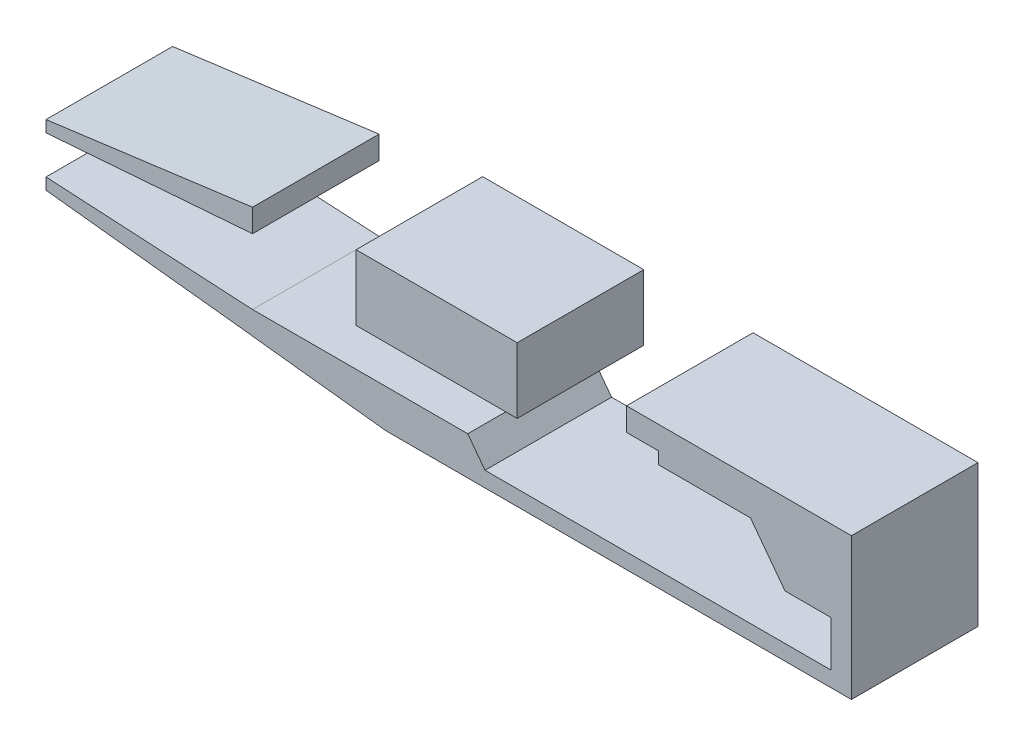
ISO-10303-21;
HEADER;
FILE_DESCRIPTION(('STEP AP214'),'2;1');
FILE_NAME('part.step','',(''),(''),'','','');
FILE_SCHEMA(('AUTOMOTIVE_DESIGN { 1 0 10303 214 1 1 1 1 }'));
ENDSEC;
DATA;
#1=APPLICATION_CONTEXT('core data for automotive mechanical design processes');
#2=APPLICATION_PROTOCOL_DEFINITION('international standard','automotive_design',2000,#1);
#3=PRODUCT_CONTEXT('',#1,'mechanical');
#4=PRODUCT('Part','Part','',(#3));
#5=PRODUCT_RELATED_PRODUCT_CATEGORY('part','',(#4));
#6=PRODUCT_DEFINITION_FORMATION('','',#4);
#7=PRODUCT_DEFINITION_CONTEXT('part definition',#1,'design');
#8=PRODUCT_DEFINITION('design','',#6,#7);
#9=PRODUCT_DEFINITION_SHAPE('','',#8);
#10=(LENGTH_UNIT() NAMED_UNIT(*) SI_UNIT(.MILLI.,.METRE.));
#11=(NAMED_UNIT(*) PLANE_ANGLE_UNIT() SI_UNIT($,.RADIAN.));
#12=(NAMED_UNIT(*) SI_UNIT($,.STERADIAN.) SOLID_ANGLE_UNIT());
#13=UNCERTAINTY_MEASURE_WITH_UNIT(LENGTH_MEASURE(1.E-05),#10,'distance_accuracy_value','');
#14=(GEOMETRIC_REPRESENTATION_CONTEXT(3) GLOBAL_UNCERTAINTY_ASSIGNED_CONTEXT((#13)) GLOBAL_UNIT_ASSIGNED_CONTEXT((#10,
#11,#12)) REPRESENTATION_CONTEXT('',''));
#15=CARTESIAN_POINT('',(0.,0.,0.));
#16=DIRECTION('',(0.,0.,1.));
#17=DIRECTION('',(1.,0.,0.));
#18=AXIS2_PLACEMENT_3D('',#15,#16,#17);
#19=CARTESIAN_POINT('',(-350.,110.,-55.));
#20=DIRECTION('',(0.,0.,1.));
#21=DIRECTION('',(1.,0.,0.));
#22=AXIS2_PLACEMENT_3D('',#19,#20,#21);
#23=PLANE('',#22);
#24=DIRECTION('',(0.6,-0.8,0.));
#25=VECTOR('',#24,1.);
#26=CARTESIAN_POINT('',(-158.611661767627,253.54125367428,-55.));
#27=LINE('',#26,#25);
#28=CARTESIAN_POINT('',(16.5442784880835,20.,-55.));
#29=VERTEX_POINT('',#28);
#30=CARTESIAN_POINT('',(31.5442784880835,0.,-55.));
#31=VERTEX_POINT('',#30);
#32=EDGE_CURVE('E353',#29,#31,#27,.T.);
#33=ORIENTED_EDGE('',*,*,#32,.T.);
#34=DIRECTION('',(-1.,0.,0.));
#35=VECTOR('',#34,1.);
#36=CARTESIAN_POINT('',(-171.496430607468,0.,-55.));
#37=LINE('',#36,#35);
#38=CARTESIAN_POINT('',(332.25,0.,-55.));
#39=VERTEX_POINT('',#38);
#40=EDGE_CURVE('E308',#39,#31,#37,.T.);
#41=ORIENTED_EDGE('',*,*,#40,.F.);
#42=DIRECTION('',(0.,-1.,0.));
#43=VECTOR('',#42,1.);
#44=CARTESIAN_POINT('',(332.25,110.,-55.));
#45=LINE('',#44,#43);
#46=CARTESIAN_POINT('',(332.25,39.5416923837129,-55.));
#47=VERTEX_POINT('',#46);
#48=EDGE_CURVE('E263',#47,#39,#45,.T.);
#49=ORIENTED_EDGE('',*,*,#48,.F.);
#50=DIRECTION('',(1.,0.,0.));
#51=VECTOR('',#50,1.);
#52=CARTESIAN_POINT('',(-350.,39.5416923837129,-55.));
#53=LINE('',#52,#51);
#54=CARTESIAN_POINT('',(292.25,39.5416923837129,-55.));
#55=VERTEX_POINT('',#54);
#56=EDGE_CURVE('E589',#55,#47,#53,.T.);
#57=ORIENTED_EDGE('',*,*,#56,.F.);
#58=DIRECTION('',(0.6,-0.8,0.));
#59=VECTOR('',#58,1.);
#60=CARTESIAN_POINT('',(27.2200123441825,392.915009258137,-55.));
#61=LINE('',#60,#59);
#62=CARTESIAN_POINT('',(262.25,79.5416923837129,-55.));
#63=VERTEX_POINT('',#62);
#64=EDGE_CURVE('E586',#63,#55,#61,.T.);
#65=ORIENTED_EDGE('',*,*,#64,.F.);
#66=DIRECTION('',(1.,0.,0.));
#67=VECTOR('',#66,1.);
#68=CARTESIAN_POINT('',(-350.,79.5416923837129,-55.));
#69=LINE('',#68,#67);
#70=CARTESIAN_POINT('',(182.25,79.5416923837129,-55.));
#71=VERTEX_POINT('',#70);
#72=EDGE_CURVE('E577',#71,#63,#69,.T.);
#73=ORIENTED_EDGE('',*,*,#72,.F.);
#74=DIRECTION('',(0.,-1.,0.));
#75=VECTOR('',#74,1.);
#76=CARTESIAN_POINT('',(182.25,110.,-55.));
#77=LINE('',#76,#75);
#78=CARTESIAN_POINT('',(182.25,90.,-55.));
#79=VERTEX_POINT('',#78);
#80=EDGE_CURVE('E569',#79,#71,#77,.T.);
#81=ORIENTED_EDGE('',*,*,#80,.F.);
#82=DIRECTION('',(1.,0.,0.));
#83=VECTOR('',#82,1.);
#84=CARTESIAN_POINT('',(-350.,90.,-55.));
#85=LINE('',#84,#83);
#86=CARTESIAN_POINT('',(154.5,90.,-55.));
#87=VERTEX_POINT('',#86);
#88=EDGE_CURVE('E562',#87,#79,#85,.T.);
#89=ORIENTED_EDGE('',*,*,#88,.F.);
#90=DIRECTION('',(0.,-1.,0.));
#91=VECTOR('',#90,1.);
#92=CARTESIAN_POINT('',(154.5,110.,-55.));
#93=LINE('',#92,#91);
#94=CARTESIAN_POINT('',(154.5,110.,-55.));
#95=VERTEX_POINT('',#94);
#96=EDGE_CURVE('E268',#95,#87,#93,.T.);
#97=ORIENTED_EDGE('',*,*,#96,.F.);
#98=DIRECTION('',(-1.,0.,0.));
#99=VECTOR('',#98,1.);
#100=CARTESIAN_POINT('',(-350.,110.,-55.));
#101=LINE('',#100,#99);
#102=CARTESIAN_POINT('',(350.,110.,-55.));
#103=VERTEX_POINT('',#102);
#104=EDGE_CURVE('E260',#103,#95,#101,.T.);
#105=ORIENTED_EDGE('',*,*,#104,.F.);
#106=DIRECTION('',(0.,1.,0.));
#107=VECTOR('',#106,1.);
#108=CARTESIAN_POINT('',(350.,0.,-55.));
#109=LINE('',#108,#107);
#110=CARTESIAN_POINT('',(350.,-13.3179448044646,-55.));
#111=VERTEX_POINT('',#110);
#112=EDGE_CURVE('E242',#111,#103,#109,.T.);
#113=ORIENTED_EDGE('',*,*,#112,.F.);
#114=DIRECTION('',(1.,0.,0.));
#115=VECTOR('',#114,1.);
#116=CARTESIAN_POINT('',(-54.7521543501291,-13.3179448044646,-55.));
#117=LINE('',#116,#115);
#118=CARTESIAN_POINT('',(-54.7521543501291,-13.3179448044646,-55.));
#119=VERTEX_POINT('',#118);
#120=EDGE_CURVE('E282',#119,#111,#117,.T.);
#121=ORIENTED_EDGE('',*,*,#120,.F.);
#122=DIRECTION('',(0.993555941863674,-0.113342800333275,0.));
#123=VECTOR('',#122,1.);
#124=CARTESIAN_POINT('',(-171.496430607468,0.,-55.));
#125=LINE('',#124,#123);
#126=CARTESIAN_POINT('',(-171.496430607468,0.,-55.));
#127=VERTEX_POINT('',#126);
#128=EDGE_CURVE('E309',#127,#119,#125,.T.);
#129=ORIENTED_EDGE('',*,*,#128,.F.);
#130=CARTESIAN_POINT('',(-170.5,0.,-55.));
#131=VERTEX_POINT('',#130);
#132=EDGE_CURVE('E252',#131,#127,#37,.T.);
#133=ORIENTED_EDGE('',*,*,#132,.F.);
#134=DIRECTION('',(-0.993849927445116,0.110735367960459,0.));
#135=VECTOR('',#134,1.);
#136=CARTESIAN_POINT('',(-359.90489036718,21.1036089545604,-55.));
#137=LINE('',#136,#135);
#138=CARTESIAN_POINT('',(-350.,20.,-55.));
#139=VERTEX_POINT('',#138);
#140=EDGE_CURVE('E301',#131,#139,#137,.T.);
#141=ORIENTED_EDGE('',*,*,#140,.T.);
#142=DIRECTION('',(0.,-1.,0.));
#143=VECTOR('',#142,1.);
#144=CARTESIAN_POINT('',(-350.,110.,-55.));
#145=LINE('',#144,#143);
#146=CARTESIAN_POINT('',(-350.,30.,-55.));
#147=VERTEX_POINT('',#146);
#148=EDGE_CURVE('E365',#147,#139,#145,.T.);
#149=ORIENTED_EDGE('',*,*,#148,.F.);
#150=DIRECTION('',(0.998451783776705,-0.0556240548065017,0.));
#151=VECTOR('',#150,1.);
#152=CARTESIAN_POINT('',(-354.443034939396,30.2475228378493,-55.));
#153=LINE('',#152,#151);
#154=CARTESIAN_POINT('',(-170.5,20.,-55.));
#155=VERTEX_POINT('',#154);
#156=EDGE_CURVE('E359',#147,#155,#153,.T.);
#157=ORIENTED_EDGE('',*,*,#156,.T.);
#158=DIRECTION('',(1.,0.,0.));
#159=VECTOR('',#158,1.);
#160=CARTESIAN_POINT('',(-350.,20.,-55.));
#161=LINE('',#160,#159);
#162=EDGE_CURVE('E295',#155,#29,#161,.T.);
#163=ORIENTED_EDGE('',*,*,#162,.T.);
#164=EDGE_LOOP('',(#33,#41,#49,#57,#65,#73,#81,#89,#97,#105,#113,#121,#129,#133,#141,#149,#157,#163));
#165=FACE_BOUND('',#164,.T.);
#166=ADVANCED_FACE('F116',(#165),#23,.F.);
#167=CARTESIAN_POINT('',(-350.,110.,55.));
#168=DIRECTION('',(0.,0.,-1.));
#169=DIRECTION('',(-1.,0.,0.));
#170=AXIS2_PLACEMENT_3D('',#167,#168,#169);
#171=PLANE('',#170);
#172=DIRECTION('',(0.,-1.,0.));
#173=VECTOR('',#172,1.);
#174=CARTESIAN_POINT('',(-350.,110.,55.));
#175=LINE('',#174,#173);
#176=CARTESIAN_POINT('',(-350.,30.,55.));
#177=VERTEX_POINT('',#176);
#178=CARTESIAN_POINT('',(-350.,20.,55.));
#179=VERTEX_POINT('',#178);
#180=EDGE_CURVE('E369',#177,#179,#175,.T.);
#181=ORIENTED_EDGE('',*,*,#180,.T.);
#182=DIRECTION('',(-0.993849927445116,0.110735367960459,0.));
#183=VECTOR('',#182,1.);
#184=CARTESIAN_POINT('',(-2.09072585280616,-18.7642645289353,55.));
#185=LINE('',#184,#183);
#186=CARTESIAN_POINT('',(-170.5,0.,55.));
#187=VERTEX_POINT('',#186);
#188=EDGE_CURVE('E302',#187,#179,#185,.T.);
#189=ORIENTED_EDGE('',*,*,#188,.F.);
#190=DIRECTION('',(-1.,0.,0.));
#191=VECTOR('',#190,1.);
#192=CARTESIAN_POINT('',(-171.496430607468,0.,55.));
#193=LINE('',#192,#191);
#194=CARTESIAN_POINT('',(-171.496430607468,0.,55.));
#195=VERTEX_POINT('',#194);
#196=EDGE_CURVE('E281',#187,#195,#193,.T.);
#197=ORIENTED_EDGE('',*,*,#196,.T.);
#198=DIRECTION('',(0.993555941863674,-0.113342800333275,0.));
#199=VECTOR('',#198,1.);
#200=CARTESIAN_POINT('',(-171.496430607468,0.,55.));
#201=LINE('',#200,#199);
#202=CARTESIAN_POINT('',(-54.7521543501291,-13.3179448044646,55.));
#203=VERTEX_POINT('',#202);
#204=EDGE_CURVE('E285',#195,#203,#201,.T.);
#205=ORIENTED_EDGE('',*,*,#204,.T.);
#206=DIRECTION('',(1.,0.,0.));
#207=VECTOR('',#206,1.);
#208=CARTESIAN_POINT('',(-54.7521543501291,-13.3179448044646,55.));
#209=LINE('',#208,#207);
#210=CARTESIAN_POINT('',(350.,-13.3179448044646,55.));
#211=VERTEX_POINT('',#210);
#212=EDGE_CURVE('E317',#203,#211,#209,.T.);
#213=ORIENTED_EDGE('',*,*,#212,.T.);
#214=DIRECTION('',(0.,1.,0.));
#215=VECTOR('',#214,1.);
#216=CARTESIAN_POINT('',(350.,0.,55.));
#217=LINE('',#216,#215);
#218=CARTESIAN_POINT('',(350.,110.,55.));
#219=VERTEX_POINT('',#218);
#220=EDGE_CURVE('E280',#211,#219,#217,.T.);
#221=ORIENTED_EDGE('',*,*,#220,.T.);
#222=DIRECTION('',(1.,0.,0.));
#223=VECTOR('',#222,1.);
#224=CARTESIAN_POINT('',(-350.,110.,55.));
#225=LINE('',#224,#223);
#226=CARTESIAN_POINT('',(154.5,110.,55.));
#227=VERTEX_POINT('',#226);
#228=EDGE_CURVE('E262',#227,#219,#225,.T.);
#229=ORIENTED_EDGE('',*,*,#228,.F.);
#230=DIRECTION('',(0.,-1.,0.));
#231=VECTOR('',#230,1.);
#232=CARTESIAN_POINT('',(154.5,0.,55.));
#233=LINE('',#232,#231);
#234=CARTESIAN_POINT('',(154.5,90.,55.));
#235=VERTEX_POINT('',#234);
#236=EDGE_CURVE('E597',#227,#235,#233,.T.);
#237=ORIENTED_EDGE('',*,*,#236,.T.);
#238=DIRECTION('',(1.,0.,0.));
#239=VECTOR('',#238,1.);
#240=CARTESIAN_POINT('',(0.,90.,55.));
#241=LINE('',#240,#239);
#242=CARTESIAN_POINT('',(182.25,90.,55.));
#243=VERTEX_POINT('',#242);
#244=EDGE_CURVE('E600',#235,#243,#241,.T.);
#245=ORIENTED_EDGE('',*,*,#244,.T.);
#246=DIRECTION('',(0.,-1.,0.));
#247=VECTOR('',#246,1.);
#248=CARTESIAN_POINT('',(182.25,0.,55.));
#249=LINE('',#248,#247);
#250=CARTESIAN_POINT('',(182.25,79.5416923837129,55.));
#251=VERTEX_POINT('',#250);
#252=EDGE_CURVE('E572',#243,#251,#249,.T.);
#253=ORIENTED_EDGE('',*,*,#252,.T.);
#254=DIRECTION('',(1.,0.,0.));
#255=VECTOR('',#254,1.);
#256=CARTESIAN_POINT('',(0.,79.5416923837129,55.));
#257=LINE('',#256,#255);
#258=CARTESIAN_POINT('',(262.25,79.5416923837129,55.));
#259=VERTEX_POINT('',#258);
#260=EDGE_CURVE('E603',#251,#259,#257,.T.);
#261=ORIENTED_EDGE('',*,*,#260,.T.);
#262=DIRECTION('',(0.6,-0.8,0.));
#263=VECTOR('',#262,1.);
#264=CARTESIAN_POINT('',(206.020012344182,154.515009258137,55.));
#265=LINE('',#264,#263);
#266=CARTESIAN_POINT('',(292.25,39.5416923837129,55.));
#267=VERTEX_POINT('',#266);
#268=EDGE_CURVE('E274',#259,#267,#265,.T.);
#269=ORIENTED_EDGE('',*,*,#268,.T.);
#270=DIRECTION('',(1.,0.,0.));
#271=VECTOR('',#270,1.);
#272=CARTESIAN_POINT('',(0.,39.5416923837129,55.));
#273=LINE('',#272,#271);
#274=CARTESIAN_POINT('',(332.25,39.5416923837129,55.));
#275=VERTEX_POINT('',#274);
#276=EDGE_CURVE('E270',#267,#275,#273,.T.);
#277=ORIENTED_EDGE('',*,*,#276,.T.);
#278=DIRECTION('',(0.,-1.,0.));
#279=VECTOR('',#278,1.);
#280=CARTESIAN_POINT('',(332.25,0.,55.));
#281=LINE('',#280,#279);
#282=CARTESIAN_POINT('',(332.25,0.,55.));
#283=VERTEX_POINT('',#282);
#284=EDGE_CURVE('E278',#275,#283,#281,.T.);
#285=ORIENTED_EDGE('',*,*,#284,.T.);
#286=CARTESIAN_POINT('',(31.5442784880836,0.,55.));
#287=VERTEX_POINT('',#286);
#288=EDGE_CURVE('E120',#283,#287,#193,.T.);
#289=ORIENTED_EDGE('',*,*,#288,.T.);
#290=DIRECTION('',(0.6,-0.8,0.));
#291=VECTOR('',#290,1.);
#292=CARTESIAN_POINT('',(20.1883382323735,15.1412536742801,55.));
#293=LINE('',#292,#291);
#294=CARTESIAN_POINT('',(16.5442784880835,20.,55.));
#295=VERTEX_POINT('',#294);
#296=EDGE_CURVE('E339',#295,#287,#293,.T.);
#297=ORIENTED_EDGE('',*,*,#296,.F.);
#298=DIRECTION('',(1.,0.,0.));
#299=VECTOR('',#298,1.);
#300=CARTESIAN_POINT('',(0.,20.,55.));
#301=LINE('',#300,#299);
#302=CARTESIAN_POINT('',(-170.5,20.,55.));
#303=VERTEX_POINT('',#302);
#304=EDGE_CURVE('E126',#303,#295,#301,.T.);
#305=ORIENTED_EDGE('',*,*,#304,.F.);
#306=DIRECTION('',(0.998451783776705,-0.0556240548065017,0.));
#307=VECTOR('',#306,1.);
#308=CARTESIAN_POINT('',(0.583225686682498,10.4689010759508,55.));
#309=LINE('',#308,#307);
#310=EDGE_CURVE('E361',#177,#303,#309,.T.);
#311=ORIENTED_EDGE('',*,*,#310,.F.);
#312=EDGE_LOOP('',(#181,#189,#197,#205,#213,#221,#229,#237,#245,#253,#261,#269,#277,#285,#289,
#297,#305,#311));
#313=FACE_BOUND('',#312,.T.);
#314=ADVANCED_FACE('F118',(#313),#171,.F.);
#315=CARTESIAN_POINT('',(-350.,110.,-55.));
#316=DIRECTION('',(1.,0.,0.));
#317=DIRECTION('',(0.,0.,-1.));
#318=AXIS2_PLACEMENT_3D('',#315,#316,#317);
#319=PLANE('',#318);
#320=ORIENTED_EDGE('',*,*,#148,.T.);
#321=DIRECTION('',(0.,0.,1.));
#322=VECTOR('',#321,1.);
#323=CARTESIAN_POINT('',(-350.,20.,-55.));
#324=LINE('',#323,#322);
#325=EDGE_CURVE('E13',#139,#179,#324,.T.);
#326=ORIENTED_EDGE('',*,*,#325,.T.);
#327=ORIENTED_EDGE('',*,*,#180,.F.);
#328=DIRECTION('',(0.,0.,1.));
#329=VECTOR('',#328,1.);
#330=CARTESIAN_POINT('',(-350.,30.,-65.));
#331=LINE('',#330,#329);
#332=EDGE_CURVE('E348',#147,#177,#331,.T.);
#333=ORIENTED_EDGE('',*,*,#332,.F.);
#334=EDGE_LOOP('',(#320,#326,#327,#333));
#335=FACE_BOUND('',#334,.T.);
#336=ADVANCED_FACE('F374',(#335),#319,.F.);
#337=CARTESIAN_POINT('',(20.1883382323735,15.1412536742801,-65.));
#338=DIRECTION('',(-0.8,-0.6,0.));
#339=DIRECTION('',(0.6,-0.8,0.));
#340=AXIS2_PLACEMENT_3D('',#337,#338,#339);
#341=PLANE('',#340);
#342=DIRECTION('',(0.,0.,1.));
#343=VECTOR('',#342,1.);
#344=CARTESIAN_POINT('',(16.5442784880835,20.,-65.));
#345=LINE('',#344,#343);
#346=EDGE_CURVE('E346',#29,#295,#345,.T.);
#347=ORIENTED_EDGE('',*,*,#346,.T.);
#348=ORIENTED_EDGE('',*,*,#296,.T.);
#349=DIRECTION('',(0.,0.,1.));
#350=VECTOR('',#349,1.);
#351=CARTESIAN_POINT('',(31.5442784880835,0.,0.));
#352=LINE('',#351,#350);
#353=EDGE_CURVE('E344',#31,#287,#352,.T.);
#354=ORIENTED_EDGE('',*,*,#353,.F.);
#355=ORIENTED_EDGE('',*,*,#32,.F.);
#356=EDGE_LOOP('',(#347,#348,#354,#355));
#357=FACE_BOUND('',#356,.T.);
#358=ADVANCED_FACE('F343',(#357),#341,.F.);
#359=CARTESIAN_POINT('',(0.583225686682498,10.4689010759508,-65.));
#360=DIRECTION('',(-0.0556240548065017,-0.998451783776705,0.));
#361=DIRECTION('',(0.998451783776705,-0.0556240548065017,0.));
#362=AXIS2_PLACEMENT_3D('',#359,#360,#361);
#363=PLANE('',#362);
#364=ORIENTED_EDGE('',*,*,#332,.T.);
#365=ORIENTED_EDGE('',*,*,#310,.T.);
#366=DIRECTION('',(0.,0.,1.));
#367=VECTOR('',#366,1.);
#368=CARTESIAN_POINT('',(-170.5,20.,-65.));
#369=LINE('',#368,#367);
#370=EDGE_CURVE('E362',#155,#303,#369,.T.);
#371=ORIENTED_EDGE('',*,*,#370,.F.);
#372=ORIENTED_EDGE('',*,*,#156,.F.);
#373=EDGE_LOOP('',(#364,#365,#371,#372));
#374=FACE_BOUND('',#373,.T.);
#375=ADVANCED_FACE('F385',(#374),#363,.F.);
#376=CARTESIAN_POINT('',(0.,20.,-65.));
#377=DIRECTION('',(0.,-1.,0.));
#378=DIRECTION('',(0.,0.,-1.));
#379=AXIS2_PLACEMENT_3D('',#376,#377,#378);
#380=PLANE('',#379);
#381=ORIENTED_EDGE('',*,*,#370,.T.);
#382=ORIENTED_EDGE('',*,*,#304,.T.);
#383=ORIENTED_EDGE('',*,*,#346,.F.);
#384=ORIENTED_EDGE('',*,*,#162,.F.);
#385=EDGE_LOOP('',(#381,#382,#383,#384));
#386=FACE_BOUND('',#385,.T.);
#387=ADVANCED_FACE('F393',(#386),#380,.F.);
#388=CARTESIAN_POINT('',(-2.09072585280616,-18.7642645289353,-65.));
#389=DIRECTION('',(0.110735367960459,0.993849927445116,0.));
#390=DIRECTION('',(-0.993849927445116,0.110735367960459,0.));
#391=AXIS2_PLACEMENT_3D('',#388,#389,#390);
#392=PLANE('',#391);
#393=DIRECTION('',(0.,0.,1.));
#394=VECTOR('',#393,1.);
#395=CARTESIAN_POINT('',(-170.5,0.,-65.));
#396=LINE('',#395,#394);
#397=EDGE_CURVE('E298',#131,#187,#396,.T.);
#398=ORIENTED_EDGE('',*,*,#397,.T.);
#399=ORIENTED_EDGE('',*,*,#188,.T.);
#400=ORIENTED_EDGE('',*,*,#325,.F.);
#401=ORIENTED_EDGE('',*,*,#140,.F.);
#402=EDGE_LOOP('',(#398,#399,#400,#401));
#403=FACE_BOUND('',#402,.T.);
#404=ADVANCED_FACE('F379',(#403),#392,.F.);
#405=CARTESIAN_POINT('',(-171.496430607468,0.,55.));
#406=DIRECTION('',(0.,-1.,0.));
#407=DIRECTION('',(1.,0.,0.));
#408=AXIS2_PLACEMENT_3D('',#405,#406,#407);
#409=PLANE('',#408);
#410=ORIENTED_EDGE('',*,*,#288,.F.);
#411=DIRECTION('',(0.,0.,1.));
#412=VECTOR('',#411,1.);
#413=CARTESIAN_POINT('',(332.25,0.,0.));
#414=LINE('',#413,#412);
#415=EDGE_CURVE('E137',#39,#283,#414,.T.);
#416=ORIENTED_EDGE('',*,*,#415,.F.);
#417=ORIENTED_EDGE('',*,*,#40,.T.);
#418=ORIENTED_EDGE('',*,*,#353,.T.);
#419=EDGE_LOOP('',(#410,#416,#417,#418));
#420=FACE_BOUND('',#419,.T.);
#421=ADVANCED_FACE('F350',(#420),#409,.F.);
#422=CARTESIAN_POINT('',(350.,0.,55.));
#423=DIRECTION('',(-1.,0.,0.));
#424=DIRECTION('',(0.,0.,1.));
#425=AXIS2_PLACEMENT_3D('',#422,#423,#424);
#426=PLANE('',#425);
#427=ORIENTED_EDGE('',*,*,#112,.T.);
#428=DIRECTION('',(0.,0.,-1.));
#429=VECTOR('',#428,1.);
#430=CARTESIAN_POINT('',(350.,110.,-55.));
#431=LINE('',#430,#429);
#432=EDGE_CURVE('E246',#219,#103,#431,.T.);
#433=ORIENTED_EDGE('',*,*,#432,.F.);
#434=ORIENTED_EDGE('',*,*,#220,.F.);
#435=DIRECTION('',(0.,0.,-1.));
#436=VECTOR('',#435,1.);
#437=CARTESIAN_POINT('',(350.,-13.3179448044646,55.));
#438=LINE('',#437,#436);
#439=EDGE_CURVE('E248',#211,#111,#438,.T.);
#440=ORIENTED_EDGE('',*,*,#439,.T.);
#441=EDGE_LOOP('',(#427,#433,#434,#440));
#442=FACE_BOUND('',#441,.T.);
#443=ADVANCED_FACE('F244',(#442),#426,.F.);
#444=ORIENTED_EDGE('',*,*,#397,.F.);
#445=ORIENTED_EDGE('',*,*,#132,.T.);
#446=DIRECTION('',(0.,0.,-1.));
#447=VECTOR('',#446,1.);
#448=CARTESIAN_POINT('',(-171.496430607468,0.,55.));
#449=LINE('',#448,#447);
#450=EDGE_CURVE('E306',#195,#127,#449,.T.);
#451=ORIENTED_EDGE('',*,*,#450,.F.);
#452=ORIENTED_EDGE('',*,*,#196,.F.);
#453=EDGE_LOOP('',(#444,#445,#451,#452));
#454=FACE_BOUND('',#453,.T.);
#455=ADVANCED_FACE('F381',(#454),#409,.F.);
#456=CARTESIAN_POINT('',(-171.496430607468,0.,55.));
#457=DIRECTION('',(0.113342800333275,0.993555941863674,0.));
#458=DIRECTION('',(-0.993555941863673,0.113342800333275,0.));
#459=AXIS2_PLACEMENT_3D('',#456,#457,#458);
#460=PLANE('',#459);
#461=ORIENTED_EDGE('',*,*,#128,.T.);
#462=DIRECTION('',(0.,0.,-1.));
#463=VECTOR('',#462,1.);
#464=CARTESIAN_POINT('',(-54.7521543501291,-13.3179448044646,55.));
#465=LINE('',#464,#463);
#466=EDGE_CURVE('E316',#203,#119,#465,.T.);
#467=ORIENTED_EDGE('',*,*,#466,.F.);
#468=ORIENTED_EDGE('',*,*,#204,.F.);
#469=ORIENTED_EDGE('',*,*,#450,.T.);
#470=EDGE_LOOP('',(#461,#467,#468,#469));
#471=FACE_BOUND('',#470,.T.);
#472=ADVANCED_FACE('F324',(#471),#460,.F.);
#473=CARTESIAN_POINT('',(-54.7521543501291,-13.3179448044646,55.));
#474=DIRECTION('',(0.,1.,0.));
#475=DIRECTION('',(0.,0.,1.));
#476=AXIS2_PLACEMENT_3D('',#473,#474,#475);
#477=PLANE('',#476);
#478=ORIENTED_EDGE('',*,*,#120,.T.);
#479=ORIENTED_EDGE('',*,*,#439,.F.);
#480=ORIENTED_EDGE('',*,*,#212,.F.);
#481=ORIENTED_EDGE('',*,*,#466,.T.);
#482=EDGE_LOOP('',(#478,#479,#480,#481));
#483=FACE_BOUND('',#482,.T.);
#484=ADVANCED_FACE('F331',(#483),#477,.F.);
#485=CARTESIAN_POINT('',(0.,110.,0.));
#486=DIRECTION('',(0.,1.,0.));
#487=DIRECTION('',(0.,0.,1.));
#488=AXIS2_PLACEMENT_3D('',#485,#486,#487);
#489=PLANE('',#488);
#490=ORIENTED_EDGE('',*,*,#104,.T.);
#491=DIRECTION('',(0.,0.,1.));
#492=VECTOR('',#491,1.);
#493=CARTESIAN_POINT('',(154.5,110.,0.));
#494=LINE('',#493,#492);
#495=EDGE_CURVE('E269',#95,#227,#494,.T.);
#496=ORIENTED_EDGE('',*,*,#495,.T.);
#497=ORIENTED_EDGE('',*,*,#228,.T.);
#498=ORIENTED_EDGE('',*,*,#432,.T.);
#499=EDGE_LOOP('',(#490,#496,#497,#498));
#500=FACE_BOUND('',#499,.T.);
#501=ADVANCED_FACE('F258',(#500),#489,.T.);
#502=CARTESIAN_POINT('',(332.25,0.,-65.));
#503=DIRECTION('',(-1.,0.,0.));
#504=DIRECTION('',(0.,0.,1.));
#505=AXIS2_PLACEMENT_3D('',#502,#503,#504);
#506=PLANE('',#505);
#507=ORIENTED_EDGE('',*,*,#48,.T.);
#508=ORIENTED_EDGE('',*,*,#415,.T.);
#509=ORIENTED_EDGE('',*,*,#284,.F.);
#510=DIRECTION('',(0.,0.,1.));
#511=VECTOR('',#510,1.);
#512=CARTESIAN_POINT('',(332.25,39.5416923837129,-65.));
#513=LINE('',#512,#511);
#514=EDGE_CURVE('E588',#47,#275,#513,.T.);
#515=ORIENTED_EDGE('',*,*,#514,.F.);
#516=EDGE_LOOP('',(#507,#508,#509,#515));
#517=FACE_BOUND('',#516,.T.);
#518=ADVANCED_FACE('F489',(#517),#506,.T.);
#519=CARTESIAN_POINT('',(0.,39.5416923837129,-65.));
#520=DIRECTION('',(0.,-1.,0.));
#521=DIRECTION('',(0.,0.,-1.));
#522=AXIS2_PLACEMENT_3D('',#519,#520,#521);
#523=PLANE('',#522);
#524=ORIENTED_EDGE('',*,*,#56,.T.);
#525=ORIENTED_EDGE('',*,*,#514,.T.);
#526=ORIENTED_EDGE('',*,*,#276,.F.);
#527=DIRECTION('',(0.,0.,1.));
#528=VECTOR('',#527,1.);
#529=CARTESIAN_POINT('',(292.25,39.5416923837129,-65.));
#530=LINE('',#529,#528);
#531=EDGE_CURVE('E585',#55,#267,#530,.T.);
#532=ORIENTED_EDGE('',*,*,#531,.F.);
#533=EDGE_LOOP('',(#524,#525,#526,#532));
#534=FACE_BOUND('',#533,.T.);
#535=ADVANCED_FACE('F498',(#534),#523,.T.);
#536=CARTESIAN_POINT('',(206.020012344182,154.515009258137,-65.));
#537=DIRECTION('',(-0.8,-0.6,0.));
#538=DIRECTION('',(0.6,-0.8,0.));
#539=AXIS2_PLACEMENT_3D('',#536,#537,#538);
#540=PLANE('',#539);
#541=ORIENTED_EDGE('',*,*,#64,.T.);
#542=ORIENTED_EDGE('',*,*,#531,.T.);
#543=ORIENTED_EDGE('',*,*,#268,.F.);
#544=DIRECTION('',(0.,0.,1.));
#545=VECTOR('',#544,1.);
#546=CARTESIAN_POINT('',(262.25,79.5416923837129,-65.));
#547=LINE('',#546,#545);
#548=EDGE_CURVE('E579',#63,#259,#547,.T.);
#549=ORIENTED_EDGE('',*,*,#548,.F.);
#550=EDGE_LOOP('',(#541,#542,#543,#549));
#551=FACE_BOUND('',#550,.T.);
#552=ADVANCED_FACE('F508',(#551),#540,.T.);
#553=CARTESIAN_POINT('',(0.,79.5416923837129,-65.));
#554=DIRECTION('',(0.,-1.,0.));
#555=DIRECTION('',(0.,0.,-1.));
#556=AXIS2_PLACEMENT_3D('',#553,#554,#555);
#557=PLANE('',#556);
#558=ORIENTED_EDGE('',*,*,#72,.T.);
#559=ORIENTED_EDGE('',*,*,#548,.T.);
#560=ORIENTED_EDGE('',*,*,#260,.F.);
#561=DIRECTION('',(0.,0.,1.));
#562=VECTOR('',#561,1.);
#563=CARTESIAN_POINT('',(182.25,79.5416923837129,-65.));
#564=LINE('',#563,#562);
#565=EDGE_CURVE('E578',#71,#251,#564,.T.);
#566=ORIENTED_EDGE('',*,*,#565,.F.);
#567=EDGE_LOOP('',(#558,#559,#560,#566));
#568=FACE_BOUND('',#567,.T.);
#569=ADVANCED_FACE('F518',(#568),#557,.T.);
#570=CARTESIAN_POINT('',(182.25,0.,-65.));
#571=DIRECTION('',(-1.,0.,0.));
#572=DIRECTION('',(0.,0.,1.));
#573=AXIS2_PLACEMENT_3D('',#570,#571,#572);
#574=PLANE('',#573);
#575=ORIENTED_EDGE('',*,*,#80,.T.);
#576=ORIENTED_EDGE('',*,*,#565,.T.);
#577=ORIENTED_EDGE('',*,*,#252,.F.);
#578=DIRECTION('',(0.,0.,1.));
#579=VECTOR('',#578,1.);
#580=CARTESIAN_POINT('',(182.25,90.,-65.));
#581=LINE('',#580,#579);
#582=EDGE_CURVE('E253',#79,#243,#581,.T.);
#583=ORIENTED_EDGE('',*,*,#582,.F.);
#584=EDGE_LOOP('',(#575,#576,#577,#583));
#585=FACE_BOUND('',#584,.T.);
#586=ADVANCED_FACE('F528',(#585),#574,.T.);
#587=CARTESIAN_POINT('',(154.5,0.,-65.));
#588=DIRECTION('',(-1.,0.,0.));
#589=DIRECTION('',(0.,0.,1.));
#590=AXIS2_PLACEMENT_3D('',#587,#588,#589);
#591=PLANE('',#590);
#592=ORIENTED_EDGE('',*,*,#96,.T.);
#593=DIRECTION('',(0.,0.,1.));
#594=VECTOR('',#593,1.);
#595=CARTESIAN_POINT('',(154.5,90.,-65.));
#596=LINE('',#595,#594);
#597=EDGE_CURVE('E566',#87,#235,#596,.T.);
#598=ORIENTED_EDGE('',*,*,#597,.T.);
#599=ORIENTED_EDGE('',*,*,#236,.F.);
#600=ORIENTED_EDGE('',*,*,#495,.F.);
#601=EDGE_LOOP('',(#592,#598,#599,#600));
#602=FACE_BOUND('',#601,.T.);
#603=ADVANCED_FACE('F538',(#602),#591,.T.);
#604=CARTESIAN_POINT('',(0.,90.,-65.));
#605=DIRECTION('',(0.,-1.,0.));
#606=DIRECTION('',(0.,0.,-1.));
#607=AXIS2_PLACEMENT_3D('',#604,#605,#606);
#608=PLANE('',#607);
#609=ORIENTED_EDGE('',*,*,#88,.T.);
#610=ORIENTED_EDGE('',*,*,#582,.T.);
#611=ORIENTED_EDGE('',*,*,#244,.F.);
#612=ORIENTED_EDGE('',*,*,#597,.F.);
#613=EDGE_LOOP('',(#609,#610,#611,#612));
#614=FACE_BOUND('',#613,.T.);
#615=ADVANCED_FACE('F548',(#614),#608,.T.);
#616=CLOSED_SHELL('',(#166,#314,#336,#358,#375,#387,#404,#421,#443,#455,#472,#484,#501,#518,
#535,#552,#569,#586,#603,#615));
#617=MANIFOLD_SOLID_BREP('B2',#616);
#618=CARTESIAN_POINT('',(0.,110.,0.));
#619=DIRECTION('',(0.,1.,0.));
#620=DIRECTION('',(0.,0.,1.));
#621=AXIS2_PLACEMENT_3D('',#618,#619,#620);
#622=PLANE('',#621);
#623=DIRECTION('',(0.,0.,-1.));
#624=VECTOR('',#623,1.);
#625=CARTESIAN_POINT('',(-80.5000000000001,110.,0.));
#626=LINE('',#625,#624);
#627=CARTESIAN_POINT('',(-80.5000000000001,110.,55.));
#628=VERTEX_POINT('',#627);
#629=CARTESIAN_POINT('',(-80.5000000000001,110.,-55.));
#630=VERTEX_POINT('',#629);
#631=EDGE_CURVE('E693',#628,#630,#626,.T.);
#632=ORIENTED_EDGE('',*,*,#631,.F.);
#633=DIRECTION('',(1.,0.,0.));
#634=VECTOR('',#633,1.);
#635=CARTESIAN_POINT('',(-350.,110.,55.));
#636=LINE('',#635,#634);
#637=CARTESIAN_POINT('',(59.4999999999999,110.,55.));
#638=VERTEX_POINT('',#637);
#639=EDGE_CURVE('E646',#628,#638,#636,.T.);
#640=ORIENTED_EDGE('',*,*,#639,.T.);
#641=DIRECTION('',(0.,0.,1.));
#642=VECTOR('',#641,1.);
#643=CARTESIAN_POINT('',(59.4999999999999,110.,0.));
#644=LINE('',#643,#642);
#645=CARTESIAN_POINT('',(59.4999999999999,110.,-55.));
#646=VERTEX_POINT('',#645);
#647=EDGE_CURVE('E695',#646,#638,#644,.T.);
#648=ORIENTED_EDGE('',*,*,#647,.F.);
#649=DIRECTION('',(-1.,0.,0.));
#650=VECTOR('',#649,1.);
#651=CARTESIAN_POINT('',(-350.,110.,-55.));
#652=LINE('',#651,#650);
#653=EDGE_CURVE('E700',#646,#630,#652,.T.);
#654=ORIENTED_EDGE('',*,*,#653,.T.);
#655=EDGE_LOOP('',(#632,#640,#648,#654));
#656=FACE_BOUND('',#655,.T.);
#657=ADVANCED_FACE('F642',(#656),#622,.T.);
#658=CARTESIAN_POINT('',(-350.,110.,-55.));
#659=DIRECTION('',(0.,0.,1.));
#660=DIRECTION('',(1.,0.,0.));
#661=AXIS2_PLACEMENT_3D('',#658,#659,#660);
#662=PLANE('',#661);
#663=DIRECTION('',(-1.,0.,0.));
#664=VECTOR('',#663,1.);
#665=CARTESIAN_POINT('',(-350.,53.,-55.));
#666=LINE('',#665,#664);
#667=CARTESIAN_POINT('',(59.4999999999999,53.,-55.));
#668=VERTEX_POINT('',#667);
#669=CARTESIAN_POINT('',(-80.5000000000001,53.,-55.));
#670=VERTEX_POINT('',#669);
#671=EDGE_CURVE('E661',#668,#670,#666,.T.);
#672=ORIENTED_EDGE('',*,*,#671,.T.);
#673=DIRECTION('',(0.,1.,0.));
#674=VECTOR('',#673,1.);
#675=CARTESIAN_POINT('',(-80.5000000000001,110.,-55.));
#676=LINE('',#675,#674);
#677=EDGE_CURVE('E683',#670,#630,#676,.T.);
#678=ORIENTED_EDGE('',*,*,#677,.T.);
#679=ORIENTED_EDGE('',*,*,#653,.F.);
#680=DIRECTION('',(0.,-1.,0.));
#681=VECTOR('',#680,1.);
#682=CARTESIAN_POINT('',(59.4999999999999,110.,-55.));
#683=LINE('',#682,#681);
#684=EDGE_CURVE('E684',#646,#668,#683,.T.);
#685=ORIENTED_EDGE('',*,*,#684,.T.);
#686=EDGE_LOOP('',(#672,#678,#679,#685));
#687=FACE_BOUND('',#686,.T.);
#688=ADVANCED_FACE('F711',(#687),#662,.F.);
#689=CARTESIAN_POINT('',(-350.,110.,55.));
#690=DIRECTION('',(0.,0.,-1.));
#691=DIRECTION('',(-1.,0.,0.));
#692=AXIS2_PLACEMENT_3D('',#689,#690,#691);
#693=PLANE('',#692);
#694=ORIENTED_EDGE('',*,*,#639,.F.);
#695=DIRECTION('',(0.,1.,0.));
#696=VECTOR('',#695,1.);
#697=CARTESIAN_POINT('',(-80.5000000000001,0.,55.));
#698=LINE('',#697,#696);
#699=CARTESIAN_POINT('',(-80.5000000000001,53.,55.));
#700=VERTEX_POINT('',#699);
#701=EDGE_CURVE('E680',#700,#628,#698,.T.);
#702=ORIENTED_EDGE('',*,*,#701,.F.);
#703=DIRECTION('',(-1.,0.,0.));
#704=VECTOR('',#703,1.);
#705=CARTESIAN_POINT('',(0.,53.,55.));
#706=LINE('',#705,#704);
#707=CARTESIAN_POINT('',(59.4999999999999,53.,55.));
#708=VERTEX_POINT('',#707);
#709=EDGE_CURVE('E114',#708,#700,#706,.T.);
#710=ORIENTED_EDGE('',*,*,#709,.F.);
#711=DIRECTION('',(0.,-1.,0.));
#712=VECTOR('',#711,1.);
#713=CARTESIAN_POINT('',(59.4999999999999,0.,55.));
#714=LINE('',#713,#712);
#715=EDGE_CURVE('E699',#638,#708,#714,.T.);
#716=ORIENTED_EDGE('',*,*,#715,.F.);
#717=EDGE_LOOP('',(#694,#702,#710,#716));
#718=FACE_BOUND('',#717,.T.);
#719=ADVANCED_FACE('F644',(#718),#693,.F.);
#720=CARTESIAN_POINT('',(-80.5000000000001,0.,-65.));
#721=DIRECTION('',(1.,0.,0.));
#722=DIRECTION('',(0.,0.,-1.));
#723=AXIS2_PLACEMENT_3D('',#720,#721,#722);
#724=PLANE('',#723);
#725=DIRECTION('',(0.,0.,1.));
#726=VECTOR('',#725,1.);
#727=CARTESIAN_POINT('',(-80.5000000000001,53.,-65.));
#728=LINE('',#727,#726);
#729=EDGE_CURVE('E676',#670,#700,#728,.T.);
#730=ORIENTED_EDGE('',*,*,#729,.T.);
#731=ORIENTED_EDGE('',*,*,#701,.T.);
#732=ORIENTED_EDGE('',*,*,#631,.T.);
#733=ORIENTED_EDGE('',*,*,#677,.F.);
#734=EDGE_LOOP('',(#730,#731,#732,#733));
#735=FACE_BOUND('',#734,.T.);
#736=ADVANCED_FACE('F677',(#735),#724,.F.);
#737=CARTESIAN_POINT('',(59.4999999999999,0.,-65.));
#738=DIRECTION('',(-1.,0.,0.));
#739=DIRECTION('',(0.,0.,1.));
#740=AXIS2_PLACEMENT_3D('',#737,#738,#739);
#741=PLANE('',#740);
#742=ORIENTED_EDGE('',*,*,#647,.T.);
#743=ORIENTED_EDGE('',*,*,#715,.T.);
#744=DIRECTION('',(0.,0.,1.));
#745=VECTOR('',#744,1.);
#746=CARTESIAN_POINT('',(59.4999999999999,53.,-65.));
#747=LINE('',#746,#745);
#748=EDGE_CURVE('E652',#668,#708,#747,.T.);
#749=ORIENTED_EDGE('',*,*,#748,.F.);
#750=ORIENTED_EDGE('',*,*,#684,.F.);
#751=EDGE_LOOP('',(#742,#743,#749,#750));
#752=FACE_BOUND('',#751,.T.);
#753=ADVANCED_FACE('F716',(#752),#741,.F.);
#754=CARTESIAN_POINT('',(0.,53.,-65.));
#755=DIRECTION('',(0.,1.,0.));
#756=DIRECTION('',(-1.,0.,0.));
#757=AXIS2_PLACEMENT_3D('',#754,#755,#756);
#758=PLANE('',#757);
#759=ORIENTED_EDGE('',*,*,#748,.T.);
#760=ORIENTED_EDGE('',*,*,#709,.T.);
#761=ORIENTED_EDGE('',*,*,#729,.F.);
#762=ORIENTED_EDGE('',*,*,#671,.F.);
#763=EDGE_LOOP('',(#759,#760,#761,#762));
#764=FACE_BOUND('',#763,.T.);
#765=ADVANCED_FACE('F687',(#764),#758,.F.);
#766=CLOSED_SHELL('',(#657,#688,#719,#736,#753,#765));
#767=MANIFOLD_SOLID_BREP('B7',#766);
#768=CARTESIAN_POINT('',(-350.,110.,-55.));
#769=DIRECTION('',(0.,0.,1.));
#770=DIRECTION('',(1.,0.,0.));
#771=AXIS2_PLACEMENT_3D('',#768,#769,#770);
#772=PLANE('',#771);
#773=DIRECTION('',(0.997065586766336,0.0765520456049504,0.));
#774=VECTOR('',#773,1.);
#775=CARTESIAN_POINT('',(-346.429286745423,63.4926169743152,-55.));
#776=LINE('',#775,#774);
#777=CARTESIAN_POINT('',(-350.,63.2184671013936,-55.));
#778=VERTEX_POINT('',#777);
#779=CARTESIAN_POINT('',(-170.5,77.,-55.));
#780=VERTEX_POINT('',#779);
#781=EDGE_CURVE('E640',#778,#780,#776,.T.);
#782=ORIENTED_EDGE('',*,*,#781,.F.);
#783=DIRECTION('',(0.,-1.,0.));
#784=VECTOR('',#783,1.);
#785=CARTESIAN_POINT('',(-350.,110.,-55.));
#786=LINE('',#785,#784);
#787=CARTESIAN_POINT('',(-350.,73.2184671013936,-55.));
#788=VERTEX_POINT('',#787);
#789=EDGE_CURVE('E825',#788,#778,#786,.T.);
#790=ORIENTED_EDGE('',*,*,#789,.F.);
#791=DIRECTION('',(-0.991337387121112,-0.131339959250358,0.));
#792=VECTOR('',#791,1.);
#793=CARTESIAN_POINT('',(-345.210963054826,73.8529553446486,-55.));
#794=LINE('',#793,#792);
#795=CARTESIAN_POINT('',(-170.5,97.,-55.));
#796=VERTEX_POINT('',#795);
#797=EDGE_CURVE('E810',#796,#788,#794,.T.);
#798=ORIENTED_EDGE('',*,*,#797,.F.);
#799=DIRECTION('',(0.,1.,0.));
#800=VECTOR('',#799,1.);
#801=CARTESIAN_POINT('',(-170.5,110.,-55.));
#802=LINE('',#801,#800);
#803=EDGE_CURVE('E774',#780,#796,#802,.T.);
#804=ORIENTED_EDGE('',*,*,#803,.F.);
#805=EDGE_LOOP('',(#782,#790,#798,#804));
#806=FACE_BOUND('',#805,.T.);
#807=ADVANCED_FACE('F766',(#806),#772,.F.);
#808=CARTESIAN_POINT('',(-350.,110.,55.));
#809=DIRECTION('',(0.,0.,-1.));
#810=DIRECTION('',(-1.,0.,0.));
#811=AXIS2_PLACEMENT_3D('',#808,#809,#810);
#812=PLANE('',#811);
#813=DIRECTION('',(0.997065586766336,0.0765520456049504,0.));
#814=VECTOR('',#813,1.);
#815=CARTESIAN_POINT('',(-6.87637736524782,89.5625868430641,55.));
#816=LINE('',#815,#814);
#817=CARTESIAN_POINT('',(-350.,63.2184671013936,55.));
#818=VERTEX_POINT('',#817);
#819=CARTESIAN_POINT('',(-170.5,77.,55.));
#820=VERTEX_POINT('',#819);
#821=EDGE_CURVE('E815',#818,#820,#816,.T.);
#822=ORIENTED_EDGE('',*,*,#821,.T.);
#823=DIRECTION('',(0.,1.,0.));
#824=VECTOR('',#823,1.);
#825=CARTESIAN_POINT('',(-170.5,0.,55.));
#826=LINE('',#825,#824);
#827=CARTESIAN_POINT('',(-170.5,97.,55.));
#828=VERTEX_POINT('',#827);
#829=EDGE_CURVE('E823',#820,#828,#826,.T.);
#830=ORIENTED_EDGE('',*,*,#829,.T.);
#831=DIRECTION('',(-0.991337387121112,-0.131339959250358,0.));
#832=VECTOR('',#831,1.);
#833=CARTESIAN_POINT('',(-15.5707710914493,117.526209215846,55.));
#834=LINE('',#833,#832);
#835=CARTESIAN_POINT('',(-350.,73.2184671013936,55.));
#836=VERTEX_POINT('',#835);
#837=EDGE_CURVE('E807',#828,#836,#834,.T.);
#838=ORIENTED_EDGE('',*,*,#837,.T.);
#839=DIRECTION('',(0.,-1.,0.));
#840=VECTOR('',#839,1.);
#841=CARTESIAN_POINT('',(-350.,110.,55.));
#842=LINE('',#841,#840);
#843=EDGE_CURVE('E821',#836,#818,#842,.T.);
#844=ORIENTED_EDGE('',*,*,#843,.T.);
#845=EDGE_LOOP('',(#822,#830,#838,#844));
#846=FACE_BOUND('',#845,.T.);
#847=ADVANCED_FACE('F820',(#846),#812,.F.);
#848=CARTESIAN_POINT('',(-350.,110.,-55.));
#849=DIRECTION('',(1.,0.,0.));
#850=DIRECTION('',(0.,0.,-1.));
#851=AXIS2_PLACEMENT_3D('',#848,#849,#850);
#852=PLANE('',#851);
#853=DIRECTION('',(0.,0.,1.));
#854=VECTOR('',#853,1.);
#855=CARTESIAN_POINT('',(-350.,63.2184671013936,-65.));
#856=LINE('',#855,#854);
#857=EDGE_CURVE('E788',#778,#818,#856,.T.);
#858=ORIENTED_EDGE('',*,*,#857,.T.);
#859=ORIENTED_EDGE('',*,*,#843,.F.);
#860=DIRECTION('',(0.,0.,1.));
#861=VECTOR('',#860,1.);
#862=CARTESIAN_POINT('',(-350.,73.2184671013936,-65.));
#863=LINE('',#862,#861);
#864=EDGE_CURVE('E804',#788,#836,#863,.T.);
#865=ORIENTED_EDGE('',*,*,#864,.F.);
#866=ORIENTED_EDGE('',*,*,#789,.T.);
#867=EDGE_LOOP('',(#858,#859,#865,#866));
#868=FACE_BOUND('',#867,.T.);
#869=ADVANCED_FACE('F768',(#868),#852,.F.);
#870=CARTESIAN_POINT('',(-6.87637736524782,89.5625868430641,-65.));
#871=DIRECTION('',(0.0765520456049504,-0.997065586766336,0.));
#872=DIRECTION('',(0.997065586766336,0.0765520456049504,0.));
#873=AXIS2_PLACEMENT_3D('',#870,#871,#872);
#874=PLANE('',#873);
#875=ORIENTED_EDGE('',*,*,#781,.T.);
#876=DIRECTION('',(0.,0.,1.));
#877=VECTOR('',#876,1.);
#878=CARTESIAN_POINT('',(-170.5,77.,-65.));
#879=LINE('',#878,#877);
#880=EDGE_CURVE('E833',#780,#820,#879,.T.);
#881=ORIENTED_EDGE('',*,*,#880,.T.);
#882=ORIENTED_EDGE('',*,*,#821,.F.);
#883=ORIENTED_EDGE('',*,*,#857,.F.);
#884=EDGE_LOOP('',(#875,#881,#882,#883));
#885=FACE_BOUND('',#884,.T.);
#886=ADVANCED_FACE('F835',(#885),#874,.T.);
#887=CARTESIAN_POINT('',(-170.5,0.,-65.));
#888=DIRECTION('',(1.,0.,0.));
#889=DIRECTION('',(0.,0.,-1.));
#890=AXIS2_PLACEMENT_3D('',#887,#888,#889);
#891=PLANE('',#890);
#892=ORIENTED_EDGE('',*,*,#803,.T.);
#893=DIRECTION('',(0.,0.,1.));
#894=VECTOR('',#893,1.);
#895=CARTESIAN_POINT('',(-170.5,97.,-65.));
#896=LINE('',#895,#894);
#897=EDGE_CURVE('E781',#796,#828,#896,.T.);
#898=ORIENTED_EDGE('',*,*,#897,.T.);
#899=ORIENTED_EDGE('',*,*,#829,.F.);
#900=ORIENTED_EDGE('',*,*,#880,.F.);
#901=EDGE_LOOP('',(#892,#898,#899,#900));
#902=FACE_BOUND('',#901,.T.);
#903=ADVANCED_FACE('F832',(#902),#891,.T.);
#904=CARTESIAN_POINT('',(-15.5707710914493,117.526209215846,-65.));
#905=DIRECTION('',(-0.131339959250358,0.991337387121112,0.));
#906=DIRECTION('',(-0.991337387121112,-0.131339959250358,0.));
#907=AXIS2_PLACEMENT_3D('',#904,#905,#906);
#908=PLANE('',#907);
#909=ORIENTED_EDGE('',*,*,#797,.T.);
#910=ORIENTED_EDGE('',*,*,#864,.T.);
#911=ORIENTED_EDGE('',*,*,#837,.F.);
#912=ORIENTED_EDGE('',*,*,#897,.F.);
#913=EDGE_LOOP('',(#909,#910,#911,#912));
#914=FACE_BOUND('',#913,.T.);
#915=ADVANCED_FACE('F806',(#914),#908,.T.);
#916=CLOSED_SHELL('',(#807,#847,#869,#886,#903,#915));
#917=MANIFOLD_SOLID_BREP('B108',#916);
#918=ADVANCED_BREP_SHAPE_REPRESENTATION('',(#18,#617,#767,#917),#14);
#919=SHAPE_DEFINITION_REPRESENTATION(#9,#918);
ENDSEC;
END-ISO-10303-21;
